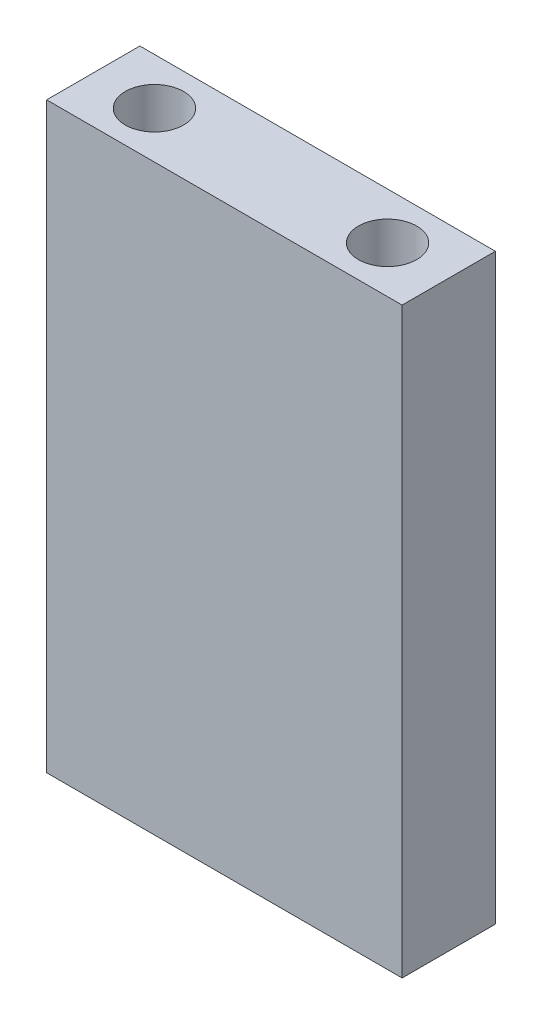
ISO-10303-21;
HEADER;
FILE_DESCRIPTION(('STEP AP214'),'2;1');
FILE_NAME('part.step','',(''),(''),'','','');
FILE_SCHEMA(('AUTOMOTIVE_DESIGN { 1 0 10303 214 1 1 1 1 }'));
ENDSEC;
DATA;
#1=APPLICATION_CONTEXT('core data for automotive mechanical design processes');
#2=APPLICATION_PROTOCOL_DEFINITION('international standard','automotive_design',2000,#1);
#3=PRODUCT_CONTEXT('',#1,'mechanical');
#4=PRODUCT('Part','Part','',(#3));
#5=PRODUCT_RELATED_PRODUCT_CATEGORY('part','',(#4));
#6=PRODUCT_DEFINITION_FORMATION('','',#4);
#7=PRODUCT_DEFINITION_CONTEXT('part definition',#1,'design');
#8=PRODUCT_DEFINITION('design','',#6,#7);
#9=PRODUCT_DEFINITION_SHAPE('','',#8);
#10=(LENGTH_UNIT() NAMED_UNIT(*) SI_UNIT(.MILLI.,.METRE.));
#11=(NAMED_UNIT(*) PLANE_ANGLE_UNIT() SI_UNIT($,.RADIAN.));
#12=(NAMED_UNIT(*) SI_UNIT($,.STERADIAN.) SOLID_ANGLE_UNIT());
#13=UNCERTAINTY_MEASURE_WITH_UNIT(LENGTH_MEASURE(1.E-05),#10,'distance_accuracy_value','');
#14=(GEOMETRIC_REPRESENTATION_CONTEXT(3) GLOBAL_UNCERTAINTY_ASSIGNED_CONTEXT((#13)) GLOBAL_UNIT_ASSIGNED_CONTEXT((#10,
#11,#12)) REPRESENTATION_CONTEXT('',''));
#15=CARTESIAN_POINT('',(0.,0.,0.));
#16=DIRECTION('',(0.,0.,1.));
#17=DIRECTION('',(1.,0.,0.));
#18=AXIS2_PLACEMENT_3D('',#15,#16,#17);
#19=CARTESIAN_POINT('',(-7.625,12.5,2.));
#20=DIRECTION('',(0.,-1.,0.));
#21=DIRECTION('',(0.,0.,-1.));
#22=AXIS2_PLACEMENT_3D('',#19,#20,#21);
#23=PLANE('',#22);
#24=DIRECTION('',(-1.,0.,0.));
#25=VECTOR('',#24,1.);
#26=CARTESIAN_POINT('',(-7.625,12.5,-2.));
#27=LINE('',#26,#25);
#28=CARTESIAN_POINT('',(7.625,12.5,-2.));
#29=VERTEX_POINT('',#28);
#30=CARTESIAN_POINT('',(-7.625,12.5,-2.));
#31=VERTEX_POINT('',#30);
#32=EDGE_CURVE('E103',#29,#31,#27,.T.);
#33=ORIENTED_EDGE('',*,*,#32,.T.);
#34=DIRECTION('',(0.,0.,-1.));
#35=VECTOR('',#34,1.);
#36=CARTESIAN_POINT('',(-7.625,12.5,2.));
#37=LINE('',#36,#35);
#38=CARTESIAN_POINT('',(-7.625,12.5,2.));
#39=VERTEX_POINT('',#38);
#40=EDGE_CURVE('E55',#39,#31,#37,.T.);
#41=ORIENTED_EDGE('',*,*,#40,.F.);
#42=DIRECTION('',(-1.,0.,0.));
#43=VECTOR('',#42,1.);
#44=CARTESIAN_POINT('',(-7.625,12.5,2.));
#45=LINE('',#44,#43);
#46=CARTESIAN_POINT('',(7.625,12.5,2.));
#47=VERTEX_POINT('',#46);
#48=EDGE_CURVE('E93',#47,#39,#45,.T.);
#49=ORIENTED_EDGE('',*,*,#48,.F.);
#50=DIRECTION('',(0.,0.,-1.));
#51=VECTOR('',#50,1.);
#52=CARTESIAN_POINT('',(7.625,12.5,2.));
#53=LINE('',#52,#51);
#54=EDGE_CURVE('E11',#47,#29,#53,.T.);
#55=ORIENTED_EDGE('',*,*,#54,.T.);
#56=EDGE_LOOP('',(#33,#41,#49,#55));
#57=FACE_BOUND('',#56,.T.);
#58=CARTESIAN_POINT('',(5.,12.5,0.));
#59=DIRECTION('',(0.,1.,0.));
#60=DIRECTION('',(0.,0.,1.));
#61=AXIS2_PLACEMENT_3D('',#58,#59,#60);
#62=CIRCLE('',#61,1.25);
#63=CARTESIAN_POINT('',(5.,12.5,1.25));
#64=VERTEX_POINT('',#63);
#65=EDGE_CURVE('E135',#64,#64,#62,.F.);
#66=ORIENTED_EDGE('',*,*,#65,.T.);
#67=EDGE_LOOP('',(#66));
#68=FACE_BOUND('',#67,.T.);
#69=CARTESIAN_POINT('',(-5.,12.5,0.));
#70=DIRECTION('',(0.,1.,0.));
#71=DIRECTION('',(0.,0.,1.));
#72=AXIS2_PLACEMENT_3D('',#69,#70,#71);
#73=CIRCLE('',#72,1.25);
#74=CARTESIAN_POINT('',(-5.,12.5,1.25));
#75=VERTEX_POINT('',#74);
#76=EDGE_CURVE('E143',#75,#75,#73,.T.);
#77=ORIENTED_EDGE('',*,*,#76,.F.);
#78=EDGE_LOOP('',(#77));
#79=FACE_BOUND('',#78,.T.);
#80=ADVANCED_FACE('F45',(#57,#68,#79),#23,.F.);
#81=CARTESIAN_POINT('',(7.625,12.5,2.));
#82=DIRECTION('',(-1.,0.,0.));
#83=DIRECTION('',(0.,-1.,0.));
#84=AXIS2_PLACEMENT_3D('',#81,#82,#83);
#85=PLANE('',#84);
#86=DIRECTION('',(0.,1.,0.));
#87=VECTOR('',#86,1.);
#88=CARTESIAN_POINT('',(7.625,12.5,-2.));
#89=LINE('',#88,#87);
#90=CARTESIAN_POINT('',(7.625,-12.5,-2.));
#91=VERTEX_POINT('',#90);
#92=EDGE_CURVE('E114',#91,#29,#89,.T.);
#93=ORIENTED_EDGE('',*,*,#92,.T.);
#94=ORIENTED_EDGE('',*,*,#54,.F.);
#95=DIRECTION('',(0.,1.,0.));
#96=VECTOR('',#95,1.);
#97=CARTESIAN_POINT('',(7.625,12.5,2.));
#98=LINE('',#97,#96);
#99=CARTESIAN_POINT('',(7.625,-12.5,2.));
#100=VERTEX_POINT('',#99);
#101=EDGE_CURVE('E98',#100,#47,#98,.T.);
#102=ORIENTED_EDGE('',*,*,#101,.F.);
#103=DIRECTION('',(0.,0.,-1.));
#104=VECTOR('',#103,1.);
#105=CARTESIAN_POINT('',(7.625,-12.5,2.));
#106=LINE('',#105,#104);
#107=EDGE_CURVE('E110',#100,#91,#106,.T.);
#108=ORIENTED_EDGE('',*,*,#107,.T.);
#109=EDGE_LOOP('',(#93,#94,#102,#108));
#110=FACE_BOUND('',#109,.T.);
#111=ADVANCED_FACE('F47',(#110),#85,.F.);
#112=CARTESIAN_POINT('',(-7.625,12.5,2.));
#113=DIRECTION('',(1.,0.,0.));
#114=DIRECTION('',(0.,0.,-1.));
#115=AXIS2_PLACEMENT_3D('',#112,#113,#114);
#116=PLANE('',#115);
#117=DIRECTION('',(0.,-1.,0.));
#118=VECTOR('',#117,1.);
#119=CARTESIAN_POINT('',(-7.625,12.5,-2.));
#120=LINE('',#119,#118);
#121=CARTESIAN_POINT('',(-7.625,-12.5,-2.));
#122=VERTEX_POINT('',#121);
#123=EDGE_CURVE('E80',#31,#122,#120,.T.);
#124=ORIENTED_EDGE('',*,*,#123,.T.);
#125=DIRECTION('',(0.,0.,-1.));
#126=VECTOR('',#125,1.);
#127=CARTESIAN_POINT('',(-7.625,-12.5,2.));
#128=LINE('',#127,#126);
#129=CARTESIAN_POINT('',(-7.625,-12.5,2.));
#130=VERTEX_POINT('',#129);
#131=EDGE_CURVE('E105',#130,#122,#128,.T.);
#132=ORIENTED_EDGE('',*,*,#131,.F.);
#133=DIRECTION('',(0.,-1.,0.));
#134=VECTOR('',#133,1.);
#135=CARTESIAN_POINT('',(-7.625,12.5,2.));
#136=LINE('',#135,#134);
#137=EDGE_CURVE('E96',#39,#130,#136,.T.);
#138=ORIENTED_EDGE('',*,*,#137,.F.);
#139=ORIENTED_EDGE('',*,*,#40,.T.);
#140=EDGE_LOOP('',(#124,#132,#138,#139));
#141=FACE_BOUND('',#140,.T.);
#142=ADVANCED_FACE('F106',(#141),#116,.F.);
#143=CARTESIAN_POINT('',(-7.625,-12.5,2.));
#144=DIRECTION('',(0.,1.,0.));
#145=DIRECTION('',(0.,0.,1.));
#146=AXIS2_PLACEMENT_3D('',#143,#144,#145);
#147=PLANE('',#146);
#148=DIRECTION('',(1.,0.,0.));
#149=VECTOR('',#148,1.);
#150=CARTESIAN_POINT('',(-7.625,-12.5,-2.));
#151=LINE('',#150,#149);
#152=EDGE_CURVE('E86',#122,#91,#151,.T.);
#153=ORIENTED_EDGE('',*,*,#152,.T.);
#154=ORIENTED_EDGE('',*,*,#107,.F.);
#155=DIRECTION('',(1.,0.,0.));
#156=VECTOR('',#155,1.);
#157=CARTESIAN_POINT('',(-7.625,-12.5,2.));
#158=LINE('',#157,#156);
#159=EDGE_CURVE('E63',#130,#100,#158,.T.);
#160=ORIENTED_EDGE('',*,*,#159,.F.);
#161=ORIENTED_EDGE('',*,*,#131,.T.);
#162=EDGE_LOOP('',(#153,#154,#160,#161));
#163=FACE_BOUND('',#162,.T.);
#164=ADVANCED_FACE('F128',(#163),#147,.F.);
#165=CARTESIAN_POINT('',(0.,0.,2.));
#166=DIRECTION('',(0.,0.,1.));
#167=DIRECTION('',(1.,0.,0.));
#168=AXIS2_PLACEMENT_3D('',#165,#166,#167);
#169=PLANE('',#168);
#170=ORIENTED_EDGE('',*,*,#101,.T.);
#171=ORIENTED_EDGE('',*,*,#48,.T.);
#172=ORIENTED_EDGE('',*,*,#137,.T.);
#173=ORIENTED_EDGE('',*,*,#159,.T.);
#174=EDGE_LOOP('',(#170,#171,#172,#173));
#175=FACE_BOUND('',#174,.T.);
#176=ADVANCED_FACE('F94',(#175),#169,.T.);
#177=CARTESIAN_POINT('',(0.,0.,-2.));
#178=DIRECTION('',(0.,0.,1.));
#179=DIRECTION('',(1.,0.,0.));
#180=AXIS2_PLACEMENT_3D('',#177,#178,#179);
#181=PLANE('',#180);
#182=ORIENTED_EDGE('',*,*,#92,.F.);
#183=ORIENTED_EDGE('',*,*,#152,.F.);
#184=ORIENTED_EDGE('',*,*,#123,.F.);
#185=ORIENTED_EDGE('',*,*,#32,.F.);
#186=EDGE_LOOP('',(#182,#183,#184,#185));
#187=FACE_BOUND('',#186,.T.);
#188=ADVANCED_FACE('F131',(#187),#181,.F.);
#189=CARTESIAN_POINT('',(5.,8.5,0.));
#190=DIRECTION('',(0.,1.,0.));
#191=DIRECTION('',(0.,0.,1.));
#192=AXIS2_PLACEMENT_3D('',#189,#190,#191);
#193=CYLINDRICAL_SURFACE('',#192,1.25);
#194=CARTESIAN_POINT('',(5.,8.5,0.));
#195=DIRECTION('',(0.,1.,0.));
#196=DIRECTION('',(0.,0.,1.));
#197=AXIS2_PLACEMENT_3D('',#194,#195,#196);
#198=CIRCLE('',#197,1.25);
#199=CARTESIAN_POINT('',(5.,8.5,1.25));
#200=VERTEX_POINT('',#199);
#201=EDGE_CURVE('E139',#200,#200,#198,.F.);
#202=ORIENTED_EDGE('',*,*,#201,.T.);
#203=EDGE_LOOP('',(#202));
#204=FACE_BOUND('',#203,.T.);
#205=ORIENTED_EDGE('',*,*,#65,.F.);
#206=EDGE_LOOP('',(#205));
#207=FACE_BOUND('',#206,.T.);
#208=ADVANCED_FACE('F172',(#204,#207),#193,.F.);
#209=CARTESIAN_POINT('',(0.,8.5,0.));
#210=DIRECTION('',(0.,1.,0.));
#211=DIRECTION('',(0.,0.,1.));
#212=AXIS2_PLACEMENT_3D('',#209,#210,#211);
#213=PLANE('',#212);
#214=ORIENTED_EDGE('',*,*,#201,.F.);
#215=EDGE_LOOP('',(#214));
#216=FACE_BOUND('',#215,.T.);
#217=ADVANCED_FACE('F156',(#216),#213,.T.);
#218=CARTESIAN_POINT('',(-5.,8.5,0.));
#219=DIRECTION('',(0.,1.,0.));
#220=DIRECTION('',(0.,0.,1.));
#221=AXIS2_PLACEMENT_3D('',#218,#219,#220);
#222=CYLINDRICAL_SURFACE('',#221,1.25);
#223=CARTESIAN_POINT('',(-5.,8.5,0.));
#224=DIRECTION('',(0.,1.,0.));
#225=DIRECTION('',(0.,0.,1.));
#226=AXIS2_PLACEMENT_3D('',#223,#224,#225);
#227=CIRCLE('',#226,1.25);
#228=CARTESIAN_POINT('',(-5.,8.5,1.25));
#229=VERTEX_POINT('',#228);
#230=EDGE_CURVE('E118',#229,#229,#227,.T.);
#231=ORIENTED_EDGE('',*,*,#230,.F.);
#232=EDGE_LOOP('',(#231));
#233=FACE_BOUND('',#232,.T.);
#234=ORIENTED_EDGE('',*,*,#76,.T.);
#235=EDGE_LOOP('',(#234));
#236=FACE_BOUND('',#235,.T.);
#237=ADVANCED_FACE('F153',(#233,#236),#222,.F.);
#238=CARTESIAN_POINT('',(0.,8.5,0.));
#239=DIRECTION('',(0.,1.,0.));
#240=DIRECTION('',(0.,0.,1.));
#241=AXIS2_PLACEMENT_3D('',#238,#239,#240);
#242=PLANE('',#241);
#243=ORIENTED_EDGE('',*,*,#230,.T.);
#244=EDGE_LOOP('',(#243));
#245=FACE_BOUND('',#244,.T.);
#246=ADVANCED_FACE('F151',(#245),#242,.T.);
#247=CLOSED_SHELL('',(#80,#111,#142,#164,#176,#188,#208,#217,#237,#246));
#248=MANIFOLD_SOLID_BREP('B2',#247);
#249=ADVANCED_BREP_SHAPE_REPRESENTATION('',(#18,#248),#14);
#250=SHAPE_DEFINITION_REPRESENTATION(#9,#249);
ENDSEC;
END-ISO-10303-21;
